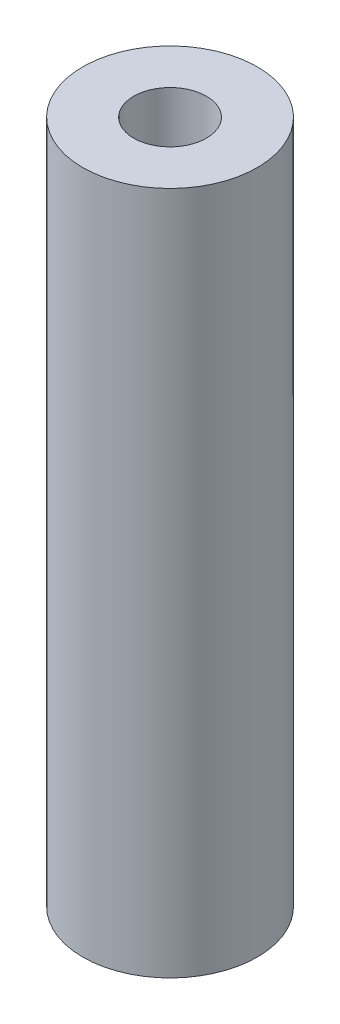
ISO-10303-21;
HEADER;
FILE_DESCRIPTION(('STEP AP214'),'2;1');
FILE_NAME('part.step','',(''),(''),'','','');
FILE_SCHEMA(('AUTOMOTIVE_DESIGN { 1 0 10303 214 1 1 1 1 }'));
ENDSEC;
DATA;
#1=APPLICATION_CONTEXT('core data for automotive mechanical design processes');
#2=APPLICATION_PROTOCOL_DEFINITION('international standard','automotive_design',2000,#1);
#3=PRODUCT_CONTEXT('',#1,'mechanical');
#4=PRODUCT('Part','Part','',(#3));
#5=PRODUCT_RELATED_PRODUCT_CATEGORY('part','',(#4));
#6=PRODUCT_DEFINITION_FORMATION('','',#4);
#7=PRODUCT_DEFINITION_CONTEXT('part definition',#1,'design');
#8=PRODUCT_DEFINITION('design','',#6,#7);
#9=PRODUCT_DEFINITION_SHAPE('','',#8);
#10=(LENGTH_UNIT() NAMED_UNIT(*) SI_UNIT(.MILLI.,.METRE.));
#11=(NAMED_UNIT(*) PLANE_ANGLE_UNIT() SI_UNIT($,.RADIAN.));
#12=(NAMED_UNIT(*) SI_UNIT($,.STERADIAN.) SOLID_ANGLE_UNIT());
#13=UNCERTAINTY_MEASURE_WITH_UNIT(LENGTH_MEASURE(1.E-05),#10,'distance_accuracy_value','');
#14=(GEOMETRIC_REPRESENTATION_CONTEXT(3) GLOBAL_UNCERTAINTY_ASSIGNED_CONTEXT((#13)) GLOBAL_UNIT_ASSIGNED_CONTEXT((#10,
#11,#12)) REPRESENTATION_CONTEXT('',''));
#15=CARTESIAN_POINT('',(0.,0.,0.));
#16=DIRECTION('',(0.,0.,1.));
#17=DIRECTION('',(1.,0.,0.));
#18=AXIS2_PLACEMENT_3D('',#15,#16,#17);
#19=CARTESIAN_POINT('',(0.,23.5,0.));
#20=DIRECTION('',(0.,-1.,0.));
#21=DIRECTION('',(0.,0.,-1.));
#22=AXIS2_PLACEMENT_3D('',#19,#20,#21);
#23=CYLINDRICAL_SURFACE('',#22,3.);
#24=CARTESIAN_POINT('',(0.,23.5,0.));
#25=DIRECTION('',(0.,1.,0.));
#26=DIRECTION('',(0.,0.,1.));
#27=AXIS2_PLACEMENT_3D('',#24,#25,#26);
#28=CIRCLE('',#27,3.);
#29=CARTESIAN_POINT('',(0.,23.5,3.));
#30=VERTEX_POINT('',#29);
#31=EDGE_CURVE('E10',#30,#30,#28,.T.);
#32=ORIENTED_EDGE('',*,*,#31,.F.);
#33=EDGE_LOOP('',(#32));
#34=FACE_BOUND('',#33,.T.);
#35=CARTESIAN_POINT('',(0.,0.,0.));
#36=DIRECTION('',(0.,1.,0.));
#37=DIRECTION('',(0.,0.,1.));
#38=AXIS2_PLACEMENT_3D('',#35,#36,#37);
#39=CIRCLE('',#38,3.);
#40=CARTESIAN_POINT('',(0.,0.,3.));
#41=VERTEX_POINT('',#40);
#42=EDGE_CURVE('E38',#41,#41,#39,.T.);
#43=ORIENTED_EDGE('',*,*,#42,.T.);
#44=EDGE_LOOP('',(#43));
#45=FACE_BOUND('',#44,.T.);
#46=ADVANCED_FACE('F35',(#34,#45),#23,.T.);
#47=CARTESIAN_POINT('',(0.,23.5,0.));
#48=DIRECTION('',(0.,1.,0.));
#49=DIRECTION('',(0.,0.,1.));
#50=AXIS2_PLACEMENT_3D('',#47,#48,#49);
#51=PLANE('',#50);
#52=CARTESIAN_POINT('',(0.,23.5,0.));
#53=DIRECTION('',(0.,1.,0.));
#54=DIRECTION('',(0.,0.,1.));
#55=AXIS2_PLACEMENT_3D('',#52,#53,#54);
#56=CIRCLE('',#55,1.25);
#57=CARTESIAN_POINT('',(0.,23.5,1.25));
#58=VERTEX_POINT('',#57);
#59=EDGE_CURVE('E49',#58,#58,#56,.T.);
#60=ORIENTED_EDGE('',*,*,#59,.F.);
#61=EDGE_LOOP('',(#60));
#62=FACE_BOUND('',#61,.T.);
#63=ORIENTED_EDGE('',*,*,#31,.T.);
#64=EDGE_LOOP('',(#63));
#65=FACE_BOUND('',#64,.T.);
#66=ADVANCED_FACE('F55',(#62,#65),#51,.T.);
#67=CARTESIAN_POINT('',(0.,0.,0.));
#68=DIRECTION('',(0.,1.,0.));
#69=DIRECTION('',(0.,0.,1.));
#70=AXIS2_PLACEMENT_3D('',#67,#68,#69);
#71=PLANE('',#70);
#72=CARTESIAN_POINT('',(0.,0.,0.));
#73=DIRECTION('',(0.,1.,0.));
#74=DIRECTION('',(0.,0.,1.));
#75=AXIS2_PLACEMENT_3D('',#72,#73,#74);
#76=CIRCLE('',#75,1.25);
#77=CARTESIAN_POINT('',(0.,0.,1.25));
#78=VERTEX_POINT('',#77);
#79=EDGE_CURVE('E45',#78,#78,#76,.T.);
#80=ORIENTED_EDGE('',*,*,#79,.T.);
#81=EDGE_LOOP('',(#80));
#82=FACE_BOUND('',#81,.T.);
#83=ORIENTED_EDGE('',*,*,#42,.F.);
#84=EDGE_LOOP('',(#83));
#85=FACE_BOUND('',#84,.T.);
#86=ADVANCED_FACE('F57',(#82,#85),#71,.F.);
#87=CARTESIAN_POINT('',(0.,23.5,0.));
#88=DIRECTION('',(0.,1.,0.));
#89=DIRECTION('',(0.,0.,1.));
#90=AXIS2_PLACEMENT_3D('',#87,#88,#89);
#91=CYLINDRICAL_SURFACE('',#90,1.25);
#92=ORIENTED_EDGE('',*,*,#79,.F.);
#93=EDGE_LOOP('',(#92));
#94=FACE_BOUND('',#93,.T.);
#95=ORIENTED_EDGE('',*,*,#59,.T.);
#96=EDGE_LOOP('',(#95));
#97=FACE_BOUND('',#96,.T.);
#98=ADVANCED_FACE('F53',(#94,#97),#91,.F.);
#99=CLOSED_SHELL('',(#46,#66,#86,#98));
#100=MANIFOLD_SOLID_BREP('B2',#99);
#101=ADVANCED_BREP_SHAPE_REPRESENTATION('',(#18,#100),#14);
#102=SHAPE_DEFINITION_REPRESENTATION(#9,#101);
ENDSEC;
END-ISO-10303-21;
